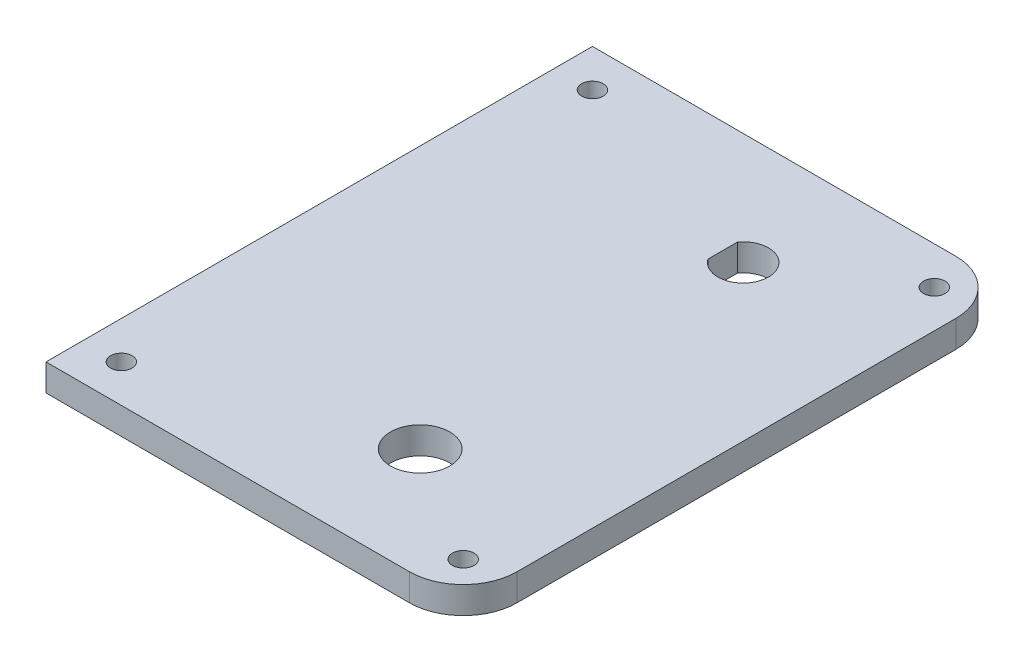
ISO-10303-21;
HEADER;
FILE_DESCRIPTION(('STEP AP214'),'2;1');
FILE_NAME('part.step','',(''),(''),'','','');
FILE_SCHEMA(('AUTOMOTIVE_DESIGN { 1 0 10303 214 1 1 1 1 }'));
ENDSEC;
DATA;
#1=APPLICATION_CONTEXT('core data for automotive mechanical design processes');
#2=APPLICATION_PROTOCOL_DEFINITION('international standard','automotive_design',2000,#1);
#3=PRODUCT_CONTEXT('',#1,'mechanical');
#4=PRODUCT('Part','Part','',(#3));
#5=PRODUCT_RELATED_PRODUCT_CATEGORY('part','',(#4));
#6=PRODUCT_DEFINITION_FORMATION('','',#4);
#7=PRODUCT_DEFINITION_CONTEXT('part definition',#1,'design');
#8=PRODUCT_DEFINITION('design','',#6,#7);
#9=PRODUCT_DEFINITION_SHAPE('','',#8);
#10=(LENGTH_UNIT() NAMED_UNIT(*) SI_UNIT(.MILLI.,.METRE.));
#11=(NAMED_UNIT(*) PLANE_ANGLE_UNIT() SI_UNIT($,.RADIAN.));
#12=(NAMED_UNIT(*) SI_UNIT($,.STERADIAN.) SOLID_ANGLE_UNIT());
#13=UNCERTAINTY_MEASURE_WITH_UNIT(LENGTH_MEASURE(1.E-05),#10,'distance_accuracy_value','');
#14=(GEOMETRIC_REPRESENTATION_CONTEXT(3) GLOBAL_UNCERTAINTY_ASSIGNED_CONTEXT((#13)) GLOBAL_UNIT_ASSIGNED_CONTEXT((#10,
#11,#12)) REPRESENTATION_CONTEXT('',''));
#15=CARTESIAN_POINT('',(0.,0.,0.));
#16=DIRECTION('',(0.,0.,1.));
#17=DIRECTION('',(1.,0.,0.));
#18=AXIS2_PLACEMENT_3D('',#15,#16,#17);
#19=CARTESIAN_POINT('',(28.75,5.,40.75));
#20=DIRECTION('',(0.,-1.,0.));
#21=DIRECTION('',(0.,0.,-1.));
#22=AXIS2_PLACEMENT_3D('',#19,#20,#21);
#23=PLANE('',#22);
#24=DIRECTION('',(0.,0.,1.));
#25=VECTOR('',#24,1.);
#26=CARTESIAN_POINT('',(-38.75,5.,-50.75));
#27=LINE('',#26,#25);
#28=CARTESIAN_POINT('',(-38.75,5.,-50.75));
#29=VERTEX_POINT('',#28);
#30=CARTESIAN_POINT('',(-38.75,5.,50.75));
#31=VERTEX_POINT('',#30);
#32=EDGE_CURVE('E119',#29,#31,#27,.T.);
#33=ORIENTED_EDGE('',*,*,#32,.T.);
#34=DIRECTION('',(1.,0.,0.));
#35=VECTOR('',#34,1.);
#36=CARTESIAN_POINT('',(-38.75,5.,50.75));
#37=LINE('',#36,#35);
#38=CARTESIAN_POINT('',(28.7499999999999,5.,50.75));
#39=VERTEX_POINT('',#38);
#40=EDGE_CURVE('E122',#31,#39,#37,.T.);
#41=ORIENTED_EDGE('',*,*,#40,.T.);
#42=CARTESIAN_POINT('',(28.75,5.,40.75));
#43=DIRECTION('',(0.,1.,0.));
#44=DIRECTION('',(0.,0.,-1.));
#45=AXIS2_PLACEMENT_3D('',#42,#43,#44);
#46=CIRCLE('',#45,10.);
#47=CARTESIAN_POINT('',(38.75,5.,40.7499999999999));
#48=VERTEX_POINT('',#47);
#49=EDGE_CURVE('E125',#39,#48,#46,.T.);
#50=ORIENTED_EDGE('',*,*,#49,.T.);
#51=DIRECTION('',(0.,0.,-1.));
#52=VECTOR('',#51,1.);
#53=CARTESIAN_POINT('',(38.75,5.,-40.7499999999999));
#54=LINE('',#53,#52);
#55=CARTESIAN_POINT('',(38.75,5.,-40.7499999999999));
#56=VERTEX_POINT('',#55);
#57=EDGE_CURVE('E127',#48,#56,#54,.T.);
#58=ORIENTED_EDGE('',*,*,#57,.T.);
#59=CARTESIAN_POINT('',(28.75,5.,-40.75));
#60=DIRECTION('',(0.,1.,0.));
#61=DIRECTION('',(0.,0.,-1.));
#62=AXIS2_PLACEMENT_3D('',#59,#60,#61);
#63=CIRCLE('',#62,10.);
#64=CARTESIAN_POINT('',(28.7499999999999,5.,-50.75));
#65=VERTEX_POINT('',#64);
#66=EDGE_CURVE('E129',#56,#65,#63,.T.);
#67=ORIENTED_EDGE('',*,*,#66,.T.);
#68=DIRECTION('',(-1.,0.,0.));
#69=VECTOR('',#68,1.);
#70=CARTESIAN_POINT('',(-38.75,5.,-50.75));
#71=LINE('',#70,#69);
#72=EDGE_CURVE('E131',#65,#29,#71,.T.);
#73=ORIENTED_EDGE('',*,*,#72,.T.);
#74=EDGE_LOOP('',(#33,#41,#50,#58,#67,#73));
#75=FACE_BOUND('',#74,.T.);
#76=CARTESIAN_POINT('',(9.99999999999999,5.,-30.));
#77=DIRECTION('',(0.,1.,0.));
#78=DIRECTION('',(0.,0.,1.));
#79=AXIS2_PLACEMENT_3D('',#76,#77,#78);
#80=CIRCLE('',#79,4.7);
#81=CARTESIAN_POINT('',(6.18850423062021,5.,-27.25));
#82=VERTEX_POINT('',#81);
#83=CARTESIAN_POINT('',(6.1885042306202,5.,-32.75));
#84=VERTEX_POINT('',#83);
#85=EDGE_CURVE('E103',#82,#84,#80,.T.);
#86=ORIENTED_EDGE('',*,*,#85,.F.);
#87=DIRECTION('',(0.,0.,1.));
#88=VECTOR('',#87,1.);
#89=CARTESIAN_POINT('',(6.18850423062021,5.,-32.75));
#90=LINE('',#89,#88);
#91=EDGE_CURVE('E97',#84,#82,#90,.T.);
#92=ORIENTED_EDGE('',*,*,#91,.F.);
#93=EDGE_LOOP('',(#86,#92));
#94=FACE_BOUND('',#93,.T.);
#95=CARTESIAN_POINT('',(10.,5.,30.));
#96=DIRECTION('',(0.,1.,0.));
#97=DIRECTION('',(0.,0.,1.));
#98=AXIS2_PLACEMENT_3D('',#95,#96,#97);
#99=CIRCLE('',#98,5.5);
#100=CARTESIAN_POINT('',(10.,5.,35.5));
#101=VERTEX_POINT('',#100);
#102=EDGE_CURVE('E115',#101,#101,#99,.T.);
#103=ORIENTED_EDGE('',*,*,#102,.F.);
#104=EDGE_LOOP('',(#103));
#105=FACE_BOUND('',#104,.T.);
#106=CARTESIAN_POINT('',(-31.75,5.,43.75));
#107=DIRECTION('',(0.,1.,0.));
#108=DIRECTION('',(0.,0.,1.));
#109=AXIS2_PLACEMENT_3D('',#106,#107,#108);
#110=CIRCLE('',#109,2.);
#111=CARTESIAN_POINT('',(-31.75,5.,45.75));
#112=VERTEX_POINT('',#111);
#113=EDGE_CURVE('E250',#112,#112,#110,.T.);
#114=ORIENTED_EDGE('',*,*,#113,.F.);
#115=EDGE_LOOP('',(#114));
#116=FACE_BOUND('',#115,.T.);
#117=CARTESIAN_POINT('',(-31.75,5.,-43.75));
#118=DIRECTION('',(0.,1.,0.));
#119=DIRECTION('',(0.,0.,1.));
#120=AXIS2_PLACEMENT_3D('',#117,#118,#119);
#121=CIRCLE('',#120,2.);
#122=CARTESIAN_POINT('',(-31.75,5.,-41.75));
#123=VERTEX_POINT('',#122);
#124=EDGE_CURVE('E244',#123,#123,#121,.T.);
#125=ORIENTED_EDGE('',*,*,#124,.F.);
#126=EDGE_LOOP('',(#125));
#127=FACE_BOUND('',#126,.T.);
#128=CARTESIAN_POINT('',(31.75,5.,-43.75));
#129=DIRECTION('',(0.,1.,0.));
#130=DIRECTION('',(0.,0.,1.));
#131=AXIS2_PLACEMENT_3D('',#128,#129,#130);
#132=CIRCLE('',#131,2.);
#133=CARTESIAN_POINT('',(31.75,5.,-41.75));
#134=VERTEX_POINT('',#133);
#135=EDGE_CURVE('E238',#134,#134,#132,.T.);
#136=ORIENTED_EDGE('',*,*,#135,.F.);
#137=EDGE_LOOP('',(#136));
#138=FACE_BOUND('',#137,.T.);
#139=CARTESIAN_POINT('',(31.75,5.,43.75));
#140=DIRECTION('',(0.,1.,0.));
#141=DIRECTION('',(0.,0.,1.));
#142=AXIS2_PLACEMENT_3D('',#139,#140,#141);
#143=CIRCLE('',#142,2.);
#144=CARTESIAN_POINT('',(31.75,5.,45.75));
#145=VERTEX_POINT('',#144);
#146=EDGE_CURVE('E229',#145,#145,#143,.T.);
#147=ORIENTED_EDGE('',*,*,#146,.F.);
#148=EDGE_LOOP('',(#147));
#149=FACE_BOUND('',#148,.T.);
#150=ADVANCED_FACE('F33',(#75,#94,#105,#116,#127,#138,#149),#23,.F.);
#151=CARTESIAN_POINT('',(28.75,0.,40.75));
#152=DIRECTION('',(0.,-1.,0.));
#153=DIRECTION('',(0.,0.,-1.));
#154=AXIS2_PLACEMENT_3D('',#151,#152,#153);
#155=PLANE('',#154);
#156=CARTESIAN_POINT('',(31.75,0.,-43.75));
#157=DIRECTION('',(0.,1.,0.));
#158=DIRECTION('',(0.,0.,1.));
#159=AXIS2_PLACEMENT_3D('',#156,#157,#158);
#160=CIRCLE('',#159,2.);
#161=CARTESIAN_POINT('',(31.75,0.,-41.75));
#162=VERTEX_POINT('',#161);
#163=EDGE_CURVE('E235',#162,#162,#160,.T.);
#164=ORIENTED_EDGE('',*,*,#163,.T.);
#165=EDGE_LOOP('',(#164));
#166=FACE_BOUND('',#165,.T.);
#167=CARTESIAN_POINT('',(-31.75,0.,43.75));
#168=DIRECTION('',(0.,1.,0.));
#169=DIRECTION('',(0.,0.,1.));
#170=AXIS2_PLACEMENT_3D('',#167,#168,#169);
#171=CIRCLE('',#170,2.);
#172=CARTESIAN_POINT('',(-31.75,0.,45.75));
#173=VERTEX_POINT('',#172);
#174=EDGE_CURVE('E247',#173,#173,#171,.T.);
#175=ORIENTED_EDGE('',*,*,#174,.T.);
#176=EDGE_LOOP('',(#175));
#177=FACE_BOUND('',#176,.T.);
#178=DIRECTION('',(0.,0.,1.));
#179=VECTOR('',#178,1.);
#180=CARTESIAN_POINT('',(6.18850423062021,0.,-32.75));
#181=LINE('',#180,#179);
#182=CARTESIAN_POINT('',(6.18850423062021,0.,-32.75));
#183=VERTEX_POINT('',#182);
#184=CARTESIAN_POINT('',(6.1885042306202,0.,-27.25));
#185=VERTEX_POINT('',#184);
#186=EDGE_CURVE('E108',#183,#185,#181,.T.);
#187=ORIENTED_EDGE('',*,*,#186,.T.);
#188=CARTESIAN_POINT('',(9.99999999999999,0.,-30.));
#189=DIRECTION('',(0.,1.,0.));
#190=DIRECTION('',(0.,0.,1.));
#191=AXIS2_PLACEMENT_3D('',#188,#189,#190);
#192=CIRCLE('',#191,4.7);
#193=EDGE_CURVE('E55',#185,#183,#192,.T.);
#194=ORIENTED_EDGE('',*,*,#193,.T.);
#195=EDGE_LOOP('',(#187,#194));
#196=FACE_BOUND('',#195,.T.);
#197=DIRECTION('',(0.,0.,1.));
#198=VECTOR('',#197,1.);
#199=CARTESIAN_POINT('',(-38.75,0.,-50.75));
#200=LINE('',#199,#198);
#201=CARTESIAN_POINT('',(-38.75,0.,-50.75));
#202=VERTEX_POINT('',#201);
#203=CARTESIAN_POINT('',(-38.75,0.,50.75));
#204=VERTEX_POINT('',#203);
#205=EDGE_CURVE('E118',#202,#204,#200,.T.);
#206=ORIENTED_EDGE('',*,*,#205,.F.);
#207=DIRECTION('',(-1.,0.,0.));
#208=VECTOR('',#207,1.);
#209=CARTESIAN_POINT('',(-38.75,0.,-50.75));
#210=LINE('',#209,#208);
#211=CARTESIAN_POINT('',(28.7499999999999,0.,-50.75));
#212=VERTEX_POINT('',#211);
#213=EDGE_CURVE('E123',#212,#202,#210,.T.);
#214=ORIENTED_EDGE('',*,*,#213,.F.);
#215=CARTESIAN_POINT('',(28.75,0.,-40.75));
#216=DIRECTION('',(0.,1.,0.));
#217=DIRECTION('',(0.,0.,-1.));
#218=AXIS2_PLACEMENT_3D('',#215,#216,#217);
#219=CIRCLE('',#218,10.);
#220=CARTESIAN_POINT('',(38.75,0.,-40.7499999999999));
#221=VERTEX_POINT('',#220);
#222=EDGE_CURVE('E142',#221,#212,#219,.T.);
#223=ORIENTED_EDGE('',*,*,#222,.F.);
#224=DIRECTION('',(0.,0.,-1.));
#225=VECTOR('',#224,1.);
#226=CARTESIAN_POINT('',(38.75,0.,-40.7499999999999));
#227=LINE('',#226,#225);
#228=CARTESIAN_POINT('',(38.75,0.,40.7499999999999));
#229=VERTEX_POINT('',#228);
#230=EDGE_CURVE('E140',#229,#221,#227,.T.);
#231=ORIENTED_EDGE('',*,*,#230,.F.);
#232=CARTESIAN_POINT('',(28.75,0.,40.75));
#233=DIRECTION('',(0.,1.,0.));
#234=DIRECTION('',(0.,0.,-1.));
#235=AXIS2_PLACEMENT_3D('',#232,#233,#234);
#236=CIRCLE('',#235,10.);
#237=CARTESIAN_POINT('',(28.7499999999999,0.,50.75));
#238=VERTEX_POINT('',#237);
#239=EDGE_CURVE('E138',#238,#229,#236,.T.);
#240=ORIENTED_EDGE('',*,*,#239,.F.);
#241=DIRECTION('',(1.,0.,0.));
#242=VECTOR('',#241,1.);
#243=CARTESIAN_POINT('',(-38.75,0.,50.75));
#244=LINE('',#243,#242);
#245=EDGE_CURVE('E136',#204,#238,#244,.T.);
#246=ORIENTED_EDGE('',*,*,#245,.F.);
#247=EDGE_LOOP('',(#206,#214,#223,#231,#240,#246));
#248=FACE_BOUND('',#247,.T.);
#249=CARTESIAN_POINT('',(10.,0.,30.));
#250=DIRECTION('',(0.,1.,0.));
#251=DIRECTION('',(0.,0.,1.));
#252=AXIS2_PLACEMENT_3D('',#249,#250,#251);
#253=CIRCLE('',#252,5.5);
#254=CARTESIAN_POINT('',(10.,0.,35.5));
#255=VERTEX_POINT('',#254);
#256=EDGE_CURVE('E112',#255,#255,#253,.T.);
#257=ORIENTED_EDGE('',*,*,#256,.T.);
#258=EDGE_LOOP('',(#257));
#259=FACE_BOUND('',#258,.T.);
#260=CARTESIAN_POINT('',(-31.75,0.,-43.75));
#261=DIRECTION('',(0.,1.,0.));
#262=DIRECTION('',(0.,0.,1.));
#263=AXIS2_PLACEMENT_3D('',#260,#261,#262);
#264=CIRCLE('',#263,2.);
#265=CARTESIAN_POINT('',(-31.75,0.,-41.75));
#266=VERTEX_POINT('',#265);
#267=EDGE_CURVE('E241',#266,#266,#264,.T.);
#268=ORIENTED_EDGE('',*,*,#267,.T.);
#269=EDGE_LOOP('',(#268));
#270=FACE_BOUND('',#269,.T.);
#271=CARTESIAN_POINT('',(31.75,0.,43.75));
#272=DIRECTION('',(0.,1.,0.));
#273=DIRECTION('',(0.,0.,1.));
#274=AXIS2_PLACEMENT_3D('',#271,#272,#273);
#275=CIRCLE('',#274,2.);
#276=CARTESIAN_POINT('',(31.75,0.,45.75));
#277=VERTEX_POINT('',#276);
#278=EDGE_CURVE('E232',#277,#277,#275,.T.);
#279=ORIENTED_EDGE('',*,*,#278,.T.);
#280=EDGE_LOOP('',(#279));
#281=FACE_BOUND('',#280,.T.);
#282=ADVANCED_FACE('F166',(#166,#177,#196,#248,#259,#270,#281),#155,.T.);
#283=CARTESIAN_POINT('',(-38.75,5.,-50.75));
#284=DIRECTION('',(1.,0.,0.));
#285=DIRECTION('',(0.,0.,-1.));
#286=AXIS2_PLACEMENT_3D('',#283,#284,#285);
#287=PLANE('',#286);
#288=ORIENTED_EDGE('',*,*,#205,.T.);
#289=DIRECTION('',(0.,-1.,0.));
#290=VECTOR('',#289,1.);
#291=CARTESIAN_POINT('',(-38.75,5.,50.75));
#292=LINE('',#291,#290);
#293=EDGE_CURVE('E11',#31,#204,#292,.T.);
#294=ORIENTED_EDGE('',*,*,#293,.F.);
#295=ORIENTED_EDGE('',*,*,#32,.F.);
#296=DIRECTION('',(0.,-1.,0.));
#297=VECTOR('',#296,1.);
#298=CARTESIAN_POINT('',(-38.75,5.,-50.75));
#299=LINE('',#298,#297);
#300=EDGE_CURVE('E133',#29,#202,#299,.T.);
#301=ORIENTED_EDGE('',*,*,#300,.T.);
#302=EDGE_LOOP('',(#288,#294,#295,#301));
#303=FACE_BOUND('',#302,.T.);
#304=ADVANCED_FACE('F35',(#303),#287,.F.);
#305=CARTESIAN_POINT('',(-38.75,5.,50.75));
#306=DIRECTION('',(0.,0.,-1.));
#307=DIRECTION('',(-1.,0.,0.));
#308=AXIS2_PLACEMENT_3D('',#305,#306,#307);
#309=PLANE('',#308);
#310=ORIENTED_EDGE('',*,*,#245,.T.);
#311=DIRECTION('',(0.,-1.,0.));
#312=VECTOR('',#311,1.);
#313=CARTESIAN_POINT('',(28.7499999999999,5.,50.75));
#314=LINE('',#313,#312);
#315=EDGE_CURVE('E41',#39,#238,#314,.T.);
#316=ORIENTED_EDGE('',*,*,#315,.F.);
#317=ORIENTED_EDGE('',*,*,#40,.F.);
#318=ORIENTED_EDGE('',*,*,#293,.T.);
#319=EDGE_LOOP('',(#310,#316,#317,#318));
#320=FACE_BOUND('',#319,.T.);
#321=ADVANCED_FACE('F183',(#320),#309,.F.);
#322=CARTESIAN_POINT('',(28.75,5.,40.75));
#323=DIRECTION('',(0.,-1.,0.));
#324=DIRECTION('',(0.,0.,-1.));
#325=AXIS2_PLACEMENT_3D('',#322,#323,#324);
#326=CYLINDRICAL_SURFACE('',#325,10.);
#327=ORIENTED_EDGE('',*,*,#239,.T.);
#328=DIRECTION('',(0.,-1.,0.));
#329=VECTOR('',#328,1.);
#330=CARTESIAN_POINT('',(38.75,5.,40.7499999999999));
#331=LINE('',#330,#329);
#332=EDGE_CURVE('E153',#48,#229,#331,.T.);
#333=ORIENTED_EDGE('',*,*,#332,.F.);
#334=ORIENTED_EDGE('',*,*,#49,.F.);
#335=ORIENTED_EDGE('',*,*,#315,.T.);
#336=EDGE_LOOP('',(#327,#333,#334,#335));
#337=FACE_BOUND('',#336,.T.);
#338=ADVANCED_FACE('F160',(#337),#326,.T.);
#339=CARTESIAN_POINT('',(38.75,5.,-40.7499999999999));
#340=DIRECTION('',(-1.,0.,0.));
#341=DIRECTION('',(0.,0.,1.));
#342=AXIS2_PLACEMENT_3D('',#339,#340,#341);
#343=PLANE('',#342);
#344=ORIENTED_EDGE('',*,*,#230,.T.);
#345=DIRECTION('',(0.,-1.,0.));
#346=VECTOR('',#345,1.);
#347=CARTESIAN_POINT('',(38.75,5.,-40.7499999999999));
#348=LINE('',#347,#346);
#349=EDGE_CURVE('E150',#56,#221,#348,.T.);
#350=ORIENTED_EDGE('',*,*,#349,.F.);
#351=ORIENTED_EDGE('',*,*,#57,.F.);
#352=ORIENTED_EDGE('',*,*,#332,.T.);
#353=EDGE_LOOP('',(#344,#350,#351,#352));
#354=FACE_BOUND('',#353,.T.);
#355=ADVANCED_FACE('F172',(#354),#343,.F.);
#356=CARTESIAN_POINT('',(28.75,5.,-40.75));
#357=DIRECTION('',(0.,-1.,0.));
#358=DIRECTION('',(0.,0.,-1.));
#359=AXIS2_PLACEMENT_3D('',#356,#357,#358);
#360=CYLINDRICAL_SURFACE('',#359,10.);
#361=ORIENTED_EDGE('',*,*,#222,.T.);
#362=DIRECTION('',(0.,-1.,0.));
#363=VECTOR('',#362,1.);
#364=CARTESIAN_POINT('',(28.7499999999999,5.,-50.75));
#365=LINE('',#364,#363);
#366=EDGE_CURVE('E147',#65,#212,#365,.T.);
#367=ORIENTED_EDGE('',*,*,#366,.F.);
#368=ORIENTED_EDGE('',*,*,#66,.F.);
#369=ORIENTED_EDGE('',*,*,#349,.T.);
#370=EDGE_LOOP('',(#361,#367,#368,#369));
#371=FACE_BOUND('',#370,.T.);
#372=ADVANCED_FACE('F176',(#371),#360,.T.);
#373=CARTESIAN_POINT('',(-38.75,5.,-50.75));
#374=DIRECTION('',(0.,0.,1.));
#375=DIRECTION('',(1.,0.,0.));
#376=AXIS2_PLACEMENT_3D('',#373,#374,#375);
#377=PLANE('',#376);
#378=ORIENTED_EDGE('',*,*,#213,.T.);
#379=ORIENTED_EDGE('',*,*,#300,.F.);
#380=ORIENTED_EDGE('',*,*,#72,.F.);
#381=ORIENTED_EDGE('',*,*,#366,.T.);
#382=EDGE_LOOP('',(#378,#379,#380,#381));
#383=FACE_BOUND('',#382,.T.);
#384=ADVANCED_FACE('F186',(#383),#377,.F.);
#385=CARTESIAN_POINT('',(9.99999999999999,5.,-30.));
#386=DIRECTION('',(0.,-1.,0.));
#387=DIRECTION('',(0.,0.,-1.));
#388=AXIS2_PLACEMENT_3D('',#385,#386,#387);
#389=CYLINDRICAL_SURFACE('',#388,4.7);
#390=ORIENTED_EDGE('',*,*,#193,.F.);
#391=DIRECTION('',(0.,-1.,0.));
#392=VECTOR('',#391,1.);
#393=CARTESIAN_POINT('',(6.18850423062021,5.,-27.25));
#394=LINE('',#393,#392);
#395=EDGE_CURVE('E99',#82,#185,#394,.T.);
#396=ORIENTED_EDGE('',*,*,#395,.F.);
#397=ORIENTED_EDGE('',*,*,#85,.T.);
#398=DIRECTION('',(0.,-1.,0.));
#399=VECTOR('',#398,1.);
#400=CARTESIAN_POINT('',(6.18850423062021,5.,-32.75));
#401=LINE('',#400,#399);
#402=EDGE_CURVE('E48',#84,#183,#401,.T.);
#403=ORIENTED_EDGE('',*,*,#402,.T.);
#404=EDGE_LOOP('',(#390,#396,#397,#403));
#405=FACE_BOUND('',#404,.T.);
#406=ADVANCED_FACE('F105',(#405),#389,.F.);
#407=CARTESIAN_POINT('',(6.18850423062021,5.,-32.75));
#408=DIRECTION('',(1.,0.,0.));
#409=DIRECTION('',(0.,0.,-1.));
#410=AXIS2_PLACEMENT_3D('',#407,#408,#409);
#411=PLANE('',#410);
#412=ORIENTED_EDGE('',*,*,#186,.F.);
#413=ORIENTED_EDGE('',*,*,#402,.F.);
#414=ORIENTED_EDGE('',*,*,#91,.T.);
#415=ORIENTED_EDGE('',*,*,#395,.T.);
#416=EDGE_LOOP('',(#412,#413,#414,#415));
#417=FACE_BOUND('',#416,.T.);
#418=ADVANCED_FACE('F98',(#417),#411,.T.);
#419=CARTESIAN_POINT('',(10.,5.,30.));
#420=DIRECTION('',(0.,-1.,0.));
#421=DIRECTION('',(0.,0.,-1.));
#422=AXIS2_PLACEMENT_3D('',#419,#420,#421);
#423=CYLINDRICAL_SURFACE('',#422,5.5);
#424=ORIENTED_EDGE('',*,*,#102,.T.);
#425=EDGE_LOOP('',(#424));
#426=FACE_BOUND('',#425,.T.);
#427=ORIENTED_EDGE('',*,*,#256,.F.);
#428=EDGE_LOOP('',(#427));
#429=FACE_BOUND('',#428,.T.);
#430=ADVANCED_FACE('F205',(#426,#429),#423,.F.);
#431=CARTESIAN_POINT('',(-31.75,5.,43.75));
#432=DIRECTION('',(0.,-1.,0.));
#433=DIRECTION('',(0.,0.,-1.));
#434=AXIS2_PLACEMENT_3D('',#431,#432,#433);
#435=CYLINDRICAL_SURFACE('',#434,2.);
#436=ORIENTED_EDGE('',*,*,#113,.T.);
#437=EDGE_LOOP('',(#436));
#438=FACE_BOUND('',#437,.T.);
#439=ORIENTED_EDGE('',*,*,#174,.F.);
#440=EDGE_LOOP('',(#439));
#441=FACE_BOUND('',#440,.T.);
#442=ADVANCED_FACE('F208',(#438,#441),#435,.F.);
#443=CARTESIAN_POINT('',(-31.75,5.,-43.75));
#444=DIRECTION('',(0.,-1.,0.));
#445=DIRECTION('',(0.,0.,-1.));
#446=AXIS2_PLACEMENT_3D('',#443,#444,#445);
#447=CYLINDRICAL_SURFACE('',#446,2.);
#448=ORIENTED_EDGE('',*,*,#124,.T.);
#449=EDGE_LOOP('',(#448));
#450=FACE_BOUND('',#449,.T.);
#451=ORIENTED_EDGE('',*,*,#267,.F.);
#452=EDGE_LOOP('',(#451));
#453=FACE_BOUND('',#452,.T.);
#454=ADVANCED_FACE('F212',(#450,#453),#447,.F.);
#455=CARTESIAN_POINT('',(31.75,5.,-43.75));
#456=DIRECTION('',(0.,-1.,0.));
#457=DIRECTION('',(0.,0.,-1.));
#458=AXIS2_PLACEMENT_3D('',#455,#456,#457);
#459=CYLINDRICAL_SURFACE('',#458,2.);
#460=ORIENTED_EDGE('',*,*,#135,.T.);
#461=EDGE_LOOP('',(#460));
#462=FACE_BOUND('',#461,.T.);
#463=ORIENTED_EDGE('',*,*,#163,.F.);
#464=EDGE_LOOP('',(#463));
#465=FACE_BOUND('',#464,.T.);
#466=ADVANCED_FACE('F216',(#462,#465),#459,.F.);
#467=CARTESIAN_POINT('',(31.75,5.,43.75));
#468=DIRECTION('',(0.,-1.,0.));
#469=DIRECTION('',(0.,0.,-1.));
#470=AXIS2_PLACEMENT_3D('',#467,#468,#469);
#471=CYLINDRICAL_SURFACE('',#470,2.);
#472=ORIENTED_EDGE('',*,*,#146,.T.);
#473=EDGE_LOOP('',(#472));
#474=FACE_BOUND('',#473,.T.);
#475=ORIENTED_EDGE('',*,*,#278,.F.);
#476=EDGE_LOOP('',(#475));
#477=FACE_BOUND('',#476,.T.);
#478=ADVANCED_FACE('F220',(#474,#477),#471,.F.);
#479=CLOSED_SHELL('',(#150,#282,#304,#321,#338,#355,#372,#384,#406,#418,#430,#442,#454,#466,#478));
#480=MANIFOLD_SOLID_BREP('B2',#479);
#481=ADVANCED_BREP_SHAPE_REPRESENTATION('',(#18,#480),#14);
#482=SHAPE_DEFINITION_REPRESENTATION(#9,#481);
ENDSEC;
END-ISO-10303-21;
